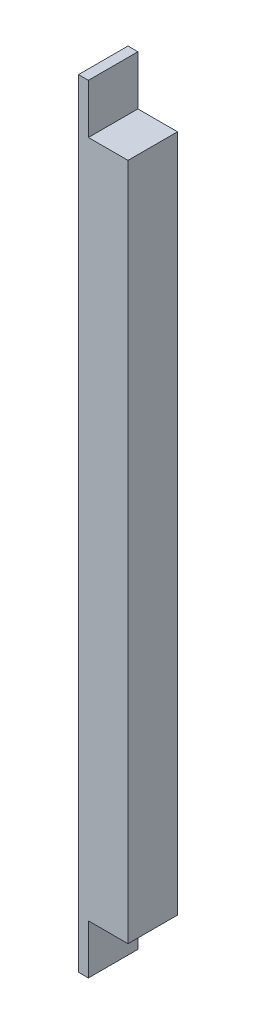
ISO-10303-21;
HEADER;
FILE_DESCRIPTION(('STEP AP214'),'2;1');
FILE_NAME('part.step','',(''),(''),'','','');
FILE_SCHEMA(('AUTOMOTIVE_DESIGN { 1 0 10303 214 1 1 1 1 }'));
ENDSEC;
DATA;
#1=APPLICATION_CONTEXT('core data for automotive mechanical design processes');
#2=APPLICATION_PROTOCOL_DEFINITION('international standard','automotive_design',2000,#1);
#3=PRODUCT_CONTEXT('',#1,'mechanical');
#4=PRODUCT('Part','Part','',(#3));
#5=PRODUCT_RELATED_PRODUCT_CATEGORY('part','',(#4));
#6=PRODUCT_DEFINITION_FORMATION('','',#4);
#7=PRODUCT_DEFINITION_CONTEXT('part definition',#1,'design');
#8=PRODUCT_DEFINITION('design','',#6,#7);
#9=PRODUCT_DEFINITION_SHAPE('','',#8);
#10=(LENGTH_UNIT() NAMED_UNIT(*) SI_UNIT(.MILLI.,.METRE.));
#11=(NAMED_UNIT(*) PLANE_ANGLE_UNIT() SI_UNIT($,.RADIAN.));
#12=(NAMED_UNIT(*) SI_UNIT($,.STERADIAN.) SOLID_ANGLE_UNIT());
#13=UNCERTAINTY_MEASURE_WITH_UNIT(LENGTH_MEASURE(1.E-05),#10,'distance_accuracy_value','');
#14=(GEOMETRIC_REPRESENTATION_CONTEXT(3) GLOBAL_UNCERTAINTY_ASSIGNED_CONTEXT((#13)) GLOBAL_UNIT_ASSIGNED_CONTEXT((#10,
#11,#12)) REPRESENTATION_CONTEXT('',''));
#15=CARTESIAN_POINT('',(0.,0.,0.));
#16=DIRECTION('',(0.,0.,1.));
#17=DIRECTION('',(1.,0.,0.));
#18=AXIS2_PLACEMENT_3D('',#15,#16,#17);
#19=CARTESIAN_POINT('',(0.,157.,0.));
#20=DIRECTION('',(1.,0.,0.));
#21=DIRECTION('',(0.,0.,-1.));
#22=AXIS2_PLACEMENT_3D('',#19,#20,#21);
#23=PLANE('',#22);
#24=DIRECTION('',(0.,0.,1.));
#25=VECTOR('',#24,1.);
#26=CARTESIAN_POINT('',(0.,0.,0.));
#27=LINE('',#26,#25);
#28=CARTESIAN_POINT('',(0.,0.,-10.));
#29=VERTEX_POINT('',#28);
#30=CARTESIAN_POINT('',(0.,0.,0.));
#31=VERTEX_POINT('',#30);
#32=EDGE_CURVE('E119',#29,#31,#27,.T.);
#33=ORIENTED_EDGE('',*,*,#32,.T.);
#34=DIRECTION('',(0.,-1.,0.));
#35=VECTOR('',#34,1.);
#36=CARTESIAN_POINT('',(0.,157.,0.));
#37=LINE('',#36,#35);
#38=CARTESIAN_POINT('',(0.,157.,0.));
#39=VERTEX_POINT('',#38);
#40=EDGE_CURVE('E11',#39,#31,#37,.T.);
#41=ORIENTED_EDGE('',*,*,#40,.F.);
#42=DIRECTION('',(0.,0.,1.));
#43=VECTOR('',#42,1.);
#44=CARTESIAN_POINT('',(0.,157.,0.));
#45=LINE('',#44,#43);
#46=CARTESIAN_POINT('',(0.,157.,-10.));
#47=VERTEX_POINT('',#46);
#48=EDGE_CURVE('E120',#47,#39,#45,.T.);
#49=ORIENTED_EDGE('',*,*,#48,.F.);
#50=DIRECTION('',(0.,-1.,0.));
#51=VECTOR('',#50,1.);
#52=CARTESIAN_POINT('',(0.,157.,-10.));
#53=LINE('',#52,#51);
#54=EDGE_CURVE('E129',#47,#29,#53,.T.);
#55=ORIENTED_EDGE('',*,*,#54,.T.);
#56=EDGE_LOOP('',(#33,#41,#49,#55));
#57=FACE_BOUND('',#56,.T.);
#58=ADVANCED_FACE('F33',(#57),#23,.F.);
#59=CARTESIAN_POINT('',(0.,157.,0.));
#60=DIRECTION('',(0.,0.,-1.));
#61=DIRECTION('',(-1.,0.,0.));
#62=AXIS2_PLACEMENT_3D('',#59,#60,#61);
#63=PLANE('',#62);
#64=DIRECTION('',(0.,-1.,0.));
#65=VECTOR('',#64,1.);
#66=CARTESIAN_POINT('',(2.,0.,0.));
#67=LINE('',#66,#65);
#68=CARTESIAN_POINT('',(2.,10.,0.));
#69=VERTEX_POINT('',#68);
#70=CARTESIAN_POINT('',(2.,0.,0.));
#71=VERTEX_POINT('',#70);
#72=EDGE_CURVE('E47',#69,#71,#67,.T.);
#73=ORIENTED_EDGE('',*,*,#72,.F.);
#74=DIRECTION('',(1.,0.,0.));
#75=VECTOR('',#74,1.);
#76=CARTESIAN_POINT('',(2.,10.,0.));
#77=LINE('',#76,#75);
#78=CARTESIAN_POINT('',(10.,10.,0.));
#79=VERTEX_POINT('',#78);
#80=EDGE_CURVE('E147',#69,#79,#77,.T.);
#81=ORIENTED_EDGE('',*,*,#80,.T.);
#82=DIRECTION('',(0.,-1.,0.));
#83=VECTOR('',#82,1.);
#84=CARTESIAN_POINT('',(10.,157.,0.));
#85=LINE('',#84,#83);
#86=CARTESIAN_POINT('',(10.,147.,0.));
#87=VERTEX_POINT('',#86);
#88=EDGE_CURVE('E40',#87,#79,#85,.T.);
#89=ORIENTED_EDGE('',*,*,#88,.F.);
#90=DIRECTION('',(1.,0.,0.));
#91=VECTOR('',#90,1.);
#92=CARTESIAN_POINT('',(2.,147.,0.));
#93=LINE('',#92,#91);
#94=CARTESIAN_POINT('',(2.,147.,0.));
#95=VERTEX_POINT('',#94);
#96=EDGE_CURVE('E146',#95,#87,#93,.T.);
#97=ORIENTED_EDGE('',*,*,#96,.F.);
#98=DIRECTION('',(0.,-1.,0.));
#99=VECTOR('',#98,1.);
#100=CARTESIAN_POINT('',(2.,157.,0.));
#101=LINE('',#100,#99);
#102=CARTESIAN_POINT('',(2.,157.,0.));
#103=VERTEX_POINT('',#102);
#104=EDGE_CURVE('E158',#103,#95,#101,.T.);
#105=ORIENTED_EDGE('',*,*,#104,.F.);
#106=DIRECTION('',(1.,0.,0.));
#107=VECTOR('',#106,1.);
#108=CARTESIAN_POINT('',(0.,157.,0.));
#109=LINE('',#108,#107);
#110=EDGE_CURVE('E124',#39,#103,#109,.T.);
#111=ORIENTED_EDGE('',*,*,#110,.F.);
#112=ORIENTED_EDGE('',*,*,#40,.T.);
#113=DIRECTION('',(1.,0.,0.));
#114=VECTOR('',#113,1.);
#115=CARTESIAN_POINT('',(0.,0.,0.));
#116=LINE('',#115,#114);
#117=EDGE_CURVE('E121',#31,#71,#116,.T.);
#118=ORIENTED_EDGE('',*,*,#117,.T.);
#119=EDGE_LOOP('',(#73,#81,#89,#97,#105,#111,#112,#118));
#120=FACE_BOUND('',#119,.T.);
#121=ADVANCED_FACE('F144',(#120),#63,.F.);
#122=CARTESIAN_POINT('',(10.,157.,0.));
#123=DIRECTION('',(-1.,0.,0.));
#124=DIRECTION('',(0.,0.,1.));
#125=AXIS2_PLACEMENT_3D('',#122,#123,#124);
#126=PLANE('',#125);
#127=ORIENTED_EDGE('',*,*,#88,.T.);
#128=DIRECTION('',(0.,0.,1.));
#129=VECTOR('',#128,1.);
#130=CARTESIAN_POINT('',(10.,10.,-10.));
#131=LINE('',#130,#129);
#132=CARTESIAN_POINT('',(10.,10.,-10.));
#133=VERTEX_POINT('',#132);
#134=EDGE_CURVE('E105',#133,#79,#131,.T.);
#135=ORIENTED_EDGE('',*,*,#134,.F.);
#136=DIRECTION('',(0.,-1.,0.));
#137=VECTOR('',#136,1.);
#138=CARTESIAN_POINT('',(10.,157.,-10.));
#139=LINE('',#138,#137);
#140=CARTESIAN_POINT('',(10.,147.,-10.));
#141=VERTEX_POINT('',#140);
#142=EDGE_CURVE('E131',#141,#133,#139,.T.);
#143=ORIENTED_EDGE('',*,*,#142,.F.);
#144=DIRECTION('',(0.,0.,-1.));
#145=VECTOR('',#144,1.);
#146=CARTESIAN_POINT('',(10.,147.,-10.));
#147=LINE('',#146,#145);
#148=EDGE_CURVE('E140',#87,#141,#147,.T.);
#149=ORIENTED_EDGE('',*,*,#148,.F.);
#150=EDGE_LOOP('',(#127,#135,#143,#149));
#151=FACE_BOUND('',#150,.T.);
#152=ADVANCED_FACE('F138',(#151),#126,.F.);
#153=CARTESIAN_POINT('',(0.,157.,-10.));
#154=DIRECTION('',(0.,0.,1.));
#155=DIRECTION('',(1.,0.,0.));
#156=AXIS2_PLACEMENT_3D('',#153,#154,#155);
#157=PLANE('',#156);
#158=ORIENTED_EDGE('',*,*,#142,.T.);
#159=DIRECTION('',(1.,0.,0.));
#160=VECTOR('',#159,1.);
#161=CARTESIAN_POINT('',(2.,10.,-10.));
#162=LINE('',#161,#160);
#163=CARTESIAN_POINT('',(2.,10.,-10.));
#164=VERTEX_POINT('',#163);
#165=EDGE_CURVE('E113',#164,#133,#162,.T.);
#166=ORIENTED_EDGE('',*,*,#165,.F.);
#167=DIRECTION('',(0.,1.,0.));
#168=VECTOR('',#167,1.);
#169=CARTESIAN_POINT('',(2.,0.,-10.));
#170=LINE('',#169,#168);
#171=CARTESIAN_POINT('',(2.,0.,-10.));
#172=VERTEX_POINT('',#171);
#173=EDGE_CURVE('E100',#172,#164,#170,.T.);
#174=ORIENTED_EDGE('',*,*,#173,.F.);
#175=DIRECTION('',(-1.,0.,0.));
#176=VECTOR('',#175,1.);
#177=CARTESIAN_POINT('',(0.,0.,-10.));
#178=LINE('',#177,#176);
#179=EDGE_CURVE('E111',#172,#29,#178,.T.);
#180=ORIENTED_EDGE('',*,*,#179,.T.);
#181=ORIENTED_EDGE('',*,*,#54,.F.);
#182=DIRECTION('',(-1.,0.,0.));
#183=VECTOR('',#182,1.);
#184=CARTESIAN_POINT('',(0.,157.,-10.));
#185=LINE('',#184,#183);
#186=CARTESIAN_POINT('',(2.,157.,-10.));
#187=VERTEX_POINT('',#186);
#188=EDGE_CURVE('E132',#187,#47,#185,.T.);
#189=ORIENTED_EDGE('',*,*,#188,.F.);
#190=DIRECTION('',(0.,1.,0.));
#191=VECTOR('',#190,1.);
#192=CARTESIAN_POINT('',(2.,157.,-10.));
#193=LINE('',#192,#191);
#194=CARTESIAN_POINT('',(2.,147.,-10.));
#195=VERTEX_POINT('',#194);
#196=EDGE_CURVE('E55',#195,#187,#193,.T.);
#197=ORIENTED_EDGE('',*,*,#196,.F.);
#198=DIRECTION('',(1.,0.,0.));
#199=VECTOR('',#198,1.);
#200=CARTESIAN_POINT('',(2.,147.,-10.));
#201=LINE('',#200,#199);
#202=EDGE_CURVE('E162',#195,#141,#201,.T.);
#203=ORIENTED_EDGE('',*,*,#202,.T.);
#204=EDGE_LOOP('',(#158,#166,#174,#180,#181,#189,#197,#203));
#205=FACE_BOUND('',#204,.T.);
#206=ADVANCED_FACE('F109',(#205),#157,.F.);
#207=CARTESIAN_POINT('',(0.,157.,0.));
#208=DIRECTION('',(0.,-1.,0.));
#209=DIRECTION('',(0.,0.,-1.));
#210=AXIS2_PLACEMENT_3D('',#207,#208,#209);
#211=PLANE('',#210);
#212=ORIENTED_EDGE('',*,*,#110,.T.);
#213=DIRECTION('',(0.,0.,1.));
#214=VECTOR('',#213,1.);
#215=CARTESIAN_POINT('',(2.,157.,-10.));
#216=LINE('',#215,#214);
#217=EDGE_CURVE('E156',#187,#103,#216,.T.);
#218=ORIENTED_EDGE('',*,*,#217,.F.);
#219=ORIENTED_EDGE('',*,*,#188,.T.);
#220=ORIENTED_EDGE('',*,*,#48,.T.);
#221=EDGE_LOOP('',(#212,#218,#219,#220));
#222=FACE_BOUND('',#221,.T.);
#223=ADVANCED_FACE('F173',(#222),#211,.F.);
#224=CARTESIAN_POINT('',(0.,0.,0.));
#225=DIRECTION('',(0.,-1.,0.));
#226=DIRECTION('',(0.,0.,-1.));
#227=AXIS2_PLACEMENT_3D('',#224,#225,#226);
#228=PLANE('',#227);
#229=DIRECTION('',(0.,0.,-1.));
#230=VECTOR('',#229,1.);
#231=CARTESIAN_POINT('',(2.,0.,-10.));
#232=LINE('',#231,#230);
#233=EDGE_CURVE('E97',#71,#172,#232,.T.);
#234=ORIENTED_EDGE('',*,*,#233,.F.);
#235=ORIENTED_EDGE('',*,*,#117,.F.);
#236=ORIENTED_EDGE('',*,*,#32,.F.);
#237=ORIENTED_EDGE('',*,*,#179,.F.);
#238=EDGE_LOOP('',(#234,#235,#236,#237));
#239=FACE_BOUND('',#238,.T.);
#240=ADVANCED_FACE('F117',(#239),#228,.T.);
#241=CARTESIAN_POINT('',(2.,147.,-10.));
#242=DIRECTION('',(0.,-1.,0.));
#243=DIRECTION('',(0.,0.,-1.));
#244=AXIS2_PLACEMENT_3D('',#241,#242,#243);
#245=PLANE('',#244);
#246=ORIENTED_EDGE('',*,*,#148,.T.);
#247=ORIENTED_EDGE('',*,*,#202,.F.);
#248=DIRECTION('',(0.,0.,-1.));
#249=VECTOR('',#248,1.);
#250=CARTESIAN_POINT('',(2.,147.,-10.));
#251=LINE('',#250,#249);
#252=EDGE_CURVE('E160',#95,#195,#251,.T.);
#253=ORIENTED_EDGE('',*,*,#252,.F.);
#254=ORIENTED_EDGE('',*,*,#96,.T.);
#255=EDGE_LOOP('',(#246,#247,#253,#254));
#256=FACE_BOUND('',#255,.T.);
#257=ADVANCED_FACE('F177',(#256),#245,.F.);
#258=CARTESIAN_POINT('',(2.,0.,0.));
#259=DIRECTION('',(-1.,0.,0.));
#260=DIRECTION('',(0.,0.,1.));
#261=AXIS2_PLACEMENT_3D('',#258,#259,#260);
#262=PLANE('',#261);
#263=ORIENTED_EDGE('',*,*,#196,.T.);
#264=ORIENTED_EDGE('',*,*,#217,.T.);
#265=ORIENTED_EDGE('',*,*,#104,.T.);
#266=ORIENTED_EDGE('',*,*,#252,.T.);
#267=EDGE_LOOP('',(#263,#264,#265,#266));
#268=FACE_BOUND('',#267,.T.);
#269=ADVANCED_FACE('F174',(#268),#262,.F.);
#270=CARTESIAN_POINT('',(2.,10.,-10.));
#271=DIRECTION('',(0.,1.,0.));
#272=DIRECTION('',(0.,0.,1.));
#273=AXIS2_PLACEMENT_3D('',#270,#271,#272);
#274=PLANE('',#273);
#275=ORIENTED_EDGE('',*,*,#134,.T.);
#276=ORIENTED_EDGE('',*,*,#80,.F.);
#277=DIRECTION('',(0.,0.,1.));
#278=VECTOR('',#277,1.);
#279=CARTESIAN_POINT('',(2.,10.,-10.));
#280=LINE('',#279,#278);
#281=EDGE_CURVE('E114',#164,#69,#280,.T.);
#282=ORIENTED_EDGE('',*,*,#281,.F.);
#283=ORIENTED_EDGE('',*,*,#165,.T.);
#284=EDGE_LOOP('',(#275,#276,#282,#283));
#285=FACE_BOUND('',#284,.T.);
#286=ADVANCED_FACE('F184',(#285),#274,.F.);
#287=CARTESIAN_POINT('',(2.,0.,0.));
#288=DIRECTION('',(-1.,0.,0.));
#289=DIRECTION('',(0.,0.,1.));
#290=AXIS2_PLACEMENT_3D('',#287,#288,#289);
#291=PLANE('',#290);
#292=ORIENTED_EDGE('',*,*,#233,.T.);
#293=ORIENTED_EDGE('',*,*,#173,.T.);
#294=ORIENTED_EDGE('',*,*,#281,.T.);
#295=ORIENTED_EDGE('',*,*,#72,.T.);
#296=EDGE_LOOP('',(#292,#293,#294,#295));
#297=FACE_BOUND('',#296,.T.);
#298=ADVANCED_FACE('F99',(#297),#291,.F.);
#299=CLOSED_SHELL('',(#58,#121,#152,#206,#223,#240,#257,#269,#286,#298));
#300=MANIFOLD_SOLID_BREP('B2',#299);
#301=ADVANCED_BREP_SHAPE_REPRESENTATION('',(#18,#300),#14);
#302=SHAPE_DEFINITION_REPRESENTATION(#9,#301);
ENDSEC;
END-ISO-10303-21;
